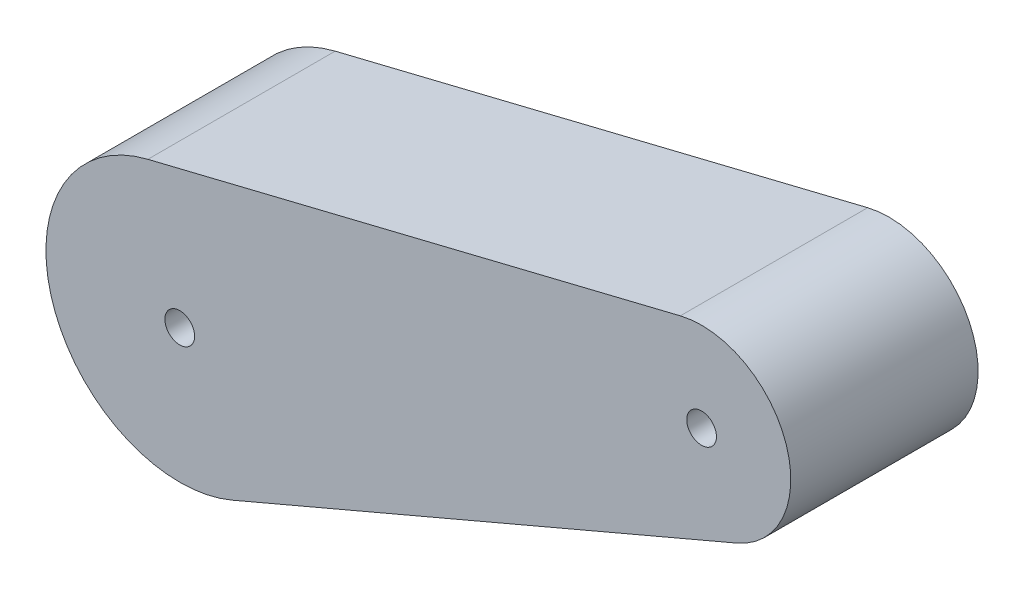
ISO-10303-21;
HEADER;
FILE_DESCRIPTION(('STEP AP214'),'2;1');
FILE_NAME('part.step','',(''),(''),'','','');
FILE_SCHEMA(('AUTOMOTIVE_DESIGN { 1 0 10303 214 1 1 1 1 }'));
ENDSEC;
DATA;
#1=APPLICATION_CONTEXT('core data for automotive mechanical design processes');
#2=APPLICATION_PROTOCOL_DEFINITION('international standard','automotive_design',2000,#1);
#3=PRODUCT_CONTEXT('',#1,'mechanical');
#4=PRODUCT('Part','Part','',(#3));
#5=PRODUCT_RELATED_PRODUCT_CATEGORY('part','',(#4));
#6=PRODUCT_DEFINITION_FORMATION('','',#4);
#7=PRODUCT_DEFINITION_CONTEXT('part definition',#1,'design');
#8=PRODUCT_DEFINITION('design','',#6,#7);
#9=PRODUCT_DEFINITION_SHAPE('','',#8);
#10=(LENGTH_UNIT() NAMED_UNIT(*) SI_UNIT(.MILLI.,.METRE.));
#11=(NAMED_UNIT(*) PLANE_ANGLE_UNIT() SI_UNIT($,.RADIAN.));
#12=(NAMED_UNIT(*) SI_UNIT($,.STERADIAN.) SOLID_ANGLE_UNIT());
#13=UNCERTAINTY_MEASURE_WITH_UNIT(LENGTH_MEASURE(1.E-05),#10,'distance_accuracy_value','');
#14=(GEOMETRIC_REPRESENTATION_CONTEXT(3) GLOBAL_UNCERTAINTY_ASSIGNED_CONTEXT((#13)) GLOBAL_UNIT_ASSIGNED_CONTEXT((#10,
#11,#12)) REPRESENTATION_CONTEXT('',''));
#15=CARTESIAN_POINT('',(0.,0.,0.));
#16=DIRECTION('',(0.,0.,1.));
#17=DIRECTION('',(1.,0.,0.));
#18=AXIS2_PLACEMENT_3D('',#15,#16,#17);
#19=CARTESIAN_POINT('',(0.,0.,31.5));
#20=DIRECTION('',(0.,0.,1.));
#21=DIRECTION('',(1.,0.,0.));
#22=AXIS2_PLACEMENT_3D('',#19,#20,#21);
#23=PLANE('',#22);
#24=CARTESIAN_POINT('',(175.503634341575,58.5104634479909,31.5));
#25=DIRECTION('',(0.,0.,1.));
#26=DIRECTION('',(1.,0.,0.));
#27=AXIS2_PLACEMENT_3D('',#24,#25,#26);
#28=CIRCLE('',#27,5.00000000000002);
#29=CARTESIAN_POINT('',(180.503634341575,58.5104634479909,31.5));
#30=VERTEX_POINT('',#29);
#31=EDGE_CURVE('E104',#30,#30,#28,.T.);
#32=ORIENTED_EDGE('',*,*,#31,.F.);
#33=EDGE_LOOP('',(#32));
#34=FACE_BOUND('',#33,.T.);
#35=CARTESIAN_POINT('',(0.,0.,31.5));
#36=DIRECTION('',(0.,0.,1.));
#37=DIRECTION('',(1.,0.,0.));
#38=AXIS2_PLACEMENT_3D('',#35,#36,#37);
#39=CIRCLE('',#38,45.);
#40=CARTESIAN_POINT('',(-10.7240579663241,43.7034847664911,31.5));
#41=VERTEX_POINT('',#40);
#42=CARTESIAN_POINT('',(17.6467725422518,-41.3955482973958,31.5));
#43=VERTEX_POINT('',#42);
#44=EDGE_CURVE('E89',#41,#43,#39,.T.);
#45=ORIENTED_EDGE('',*,*,#44,.T.);
#46=DIRECTION('',(0.919901073275462,0.39215050093893,0.));
#47=VECTOR('',#46,1.);
#48=CARTESIAN_POINT('',(17.6467725422518,-41.3955482973958,31.5));
#49=LINE('',#48,#47);
#50=CARTESIAN_POINT('',(187.268149369743,30.913431249727,31.5));
#51=VERTEX_POINT('',#50);
#52=EDGE_CURVE('E84',#43,#51,#49,.T.);
#53=ORIENTED_EDGE('',*,*,#52,.T.);
#54=CARTESIAN_POINT('',(175.503634341575,58.5104634479909,31.5));
#55=DIRECTION('',(0.,0.,1.));
#56=DIRECTION('',(1.,0.,0.));
#57=AXIS2_PLACEMENT_3D('',#54,#55,#56);
#58=CIRCLE('',#57,30.);
#59=CARTESIAN_POINT('',(168.354262364026,87.6461199589849,31.5));
#60=VERTEX_POINT('',#59);
#61=EDGE_CURVE('E87',#51,#60,#58,.T.);
#62=ORIENTED_EDGE('',*,*,#61,.T.);
#63=DIRECTION('',(-0.971188550366469,-0.238312399251647,0.));
#64=VECTOR('',#63,1.);
#65=CARTESIAN_POINT('',(-10.7240579663241,43.7034847664911,31.5));
#66=LINE('',#65,#64);
#67=EDGE_CURVE('E54',#60,#41,#66,.T.);
#68=ORIENTED_EDGE('',*,*,#67,.T.);
#69=EDGE_LOOP('',(#45,#53,#62,#68));
#70=FACE_BOUND('',#69,.T.);
#71=CARTESIAN_POINT('',(0.,0.,31.5));
#72=DIRECTION('',(0.,0.,1.));
#73=DIRECTION('',(1.,0.,0.));
#74=AXIS2_PLACEMENT_3D('',#71,#72,#73);
#75=CIRCLE('',#74,5.);
#76=CARTESIAN_POINT('',(5.,0.,31.5));
#77=VERTEX_POINT('',#76);
#78=EDGE_CURVE('E119',#77,#77,#75,.T.);
#79=ORIENTED_EDGE('',*,*,#78,.F.);
#80=EDGE_LOOP('',(#79));
#81=FACE_BOUND('',#80,.T.);
#82=ADVANCED_FACE('F37',(#34,#70,#81),#23,.T.);
#83=CARTESIAN_POINT('',(0.,0.,-31.5));
#84=DIRECTION('',(0.,0.,1.));
#85=DIRECTION('',(1.,0.,0.));
#86=AXIS2_PLACEMENT_3D('',#83,#84,#85);
#87=PLANE('',#86);
#88=CARTESIAN_POINT('',(0.,0.,-31.5));
#89=DIRECTION('',(0.,0.,1.));
#90=DIRECTION('',(1.,0.,0.));
#91=AXIS2_PLACEMENT_3D('',#88,#89,#90);
#92=CIRCLE('',#91,45.);
#93=CARTESIAN_POINT('',(-10.7240579663241,43.7034847664911,-31.5));
#94=VERTEX_POINT('',#93);
#95=CARTESIAN_POINT('',(17.6467725422518,-41.3955482973958,-31.5));
#96=VERTEX_POINT('',#95);
#97=EDGE_CURVE('E101',#94,#96,#92,.T.);
#98=ORIENTED_EDGE('',*,*,#97,.F.);
#99=DIRECTION('',(-0.971188550366469,-0.238312399251647,0.));
#100=VECTOR('',#99,1.);
#101=CARTESIAN_POINT('',(-10.7240579663241,43.7034847664911,-31.5));
#102=LINE('',#101,#100);
#103=CARTESIAN_POINT('',(168.354262364026,87.6461199589849,-31.5));
#104=VERTEX_POINT('',#103);
#105=EDGE_CURVE('E77',#104,#94,#102,.T.);
#106=ORIENTED_EDGE('',*,*,#105,.F.);
#107=CARTESIAN_POINT('',(175.503634341575,58.5104634479909,-31.5));
#108=DIRECTION('',(0.,0.,1.));
#109=DIRECTION('',(1.,0.,0.));
#110=AXIS2_PLACEMENT_3D('',#107,#108,#109);
#111=CIRCLE('',#110,30.);
#112=CARTESIAN_POINT('',(187.268149369743,30.913431249727,-31.5));
#113=VERTEX_POINT('',#112);
#114=EDGE_CURVE('E71',#113,#104,#111,.T.);
#115=ORIENTED_EDGE('',*,*,#114,.F.);
#116=DIRECTION('',(0.919901073275462,0.39215050093893,0.));
#117=VECTOR('',#116,1.);
#118=CARTESIAN_POINT('',(17.6467725422518,-41.3955482973958,-31.5));
#119=LINE('',#118,#117);
#120=EDGE_CURVE('E93',#96,#113,#119,.T.);
#121=ORIENTED_EDGE('',*,*,#120,.F.);
#122=EDGE_LOOP('',(#98,#106,#115,#121));
#123=FACE_BOUND('',#122,.T.);
#124=CARTESIAN_POINT('',(175.503634341575,58.5104634479909,-31.5));
#125=DIRECTION('',(0.,0.,1.));
#126=DIRECTION('',(1.,0.,0.));
#127=AXIS2_PLACEMENT_3D('',#124,#125,#126);
#128=CIRCLE('',#127,5.00000000000002);
#129=CARTESIAN_POINT('',(180.503634341575,58.5104634479909,-31.5));
#130=VERTEX_POINT('',#129);
#131=EDGE_CURVE('E116',#130,#130,#128,.T.);
#132=ORIENTED_EDGE('',*,*,#131,.T.);
#133=EDGE_LOOP('',(#132));
#134=FACE_BOUND('',#133,.T.);
#135=CARTESIAN_POINT('',(0.,0.,-31.5));
#136=DIRECTION('',(0.,0.,1.));
#137=DIRECTION('',(1.,0.,0.));
#138=AXIS2_PLACEMENT_3D('',#135,#136,#137);
#139=CIRCLE('',#138,5.);
#140=CARTESIAN_POINT('',(5.,0.,-31.5));
#141=VERTEX_POINT('',#140);
#142=EDGE_CURVE('E122',#141,#141,#139,.T.);
#143=ORIENTED_EDGE('',*,*,#142,.T.);
#144=EDGE_LOOP('',(#143));
#145=FACE_BOUND('',#144,.T.);
#146=ADVANCED_FACE('F112',(#123,#134,#145),#87,.F.);
#147=CARTESIAN_POINT('',(0.,0.,31.5));
#148=DIRECTION('',(0.,0.,-1.));
#149=DIRECTION('',(-1.,0.,0.));
#150=AXIS2_PLACEMENT_3D('',#147,#148,#149);
#151=CYLINDRICAL_SURFACE('',#150,45.);
#152=ORIENTED_EDGE('',*,*,#97,.T.);
#153=DIRECTION('',(0.,0.,-1.));
#154=VECTOR('',#153,1.);
#155=CARTESIAN_POINT('',(17.6467725422518,-41.3955482973958,31.5));
#156=LINE('',#155,#154);
#157=EDGE_CURVE('E11',#43,#96,#156,.T.);
#158=ORIENTED_EDGE('',*,*,#157,.F.);
#159=ORIENTED_EDGE('',*,*,#44,.F.);
#160=DIRECTION('',(0.,0.,-1.));
#161=VECTOR('',#160,1.);
#162=CARTESIAN_POINT('',(-10.7240579663241,43.7034847664911,31.5));
#163=LINE('',#162,#161);
#164=EDGE_CURVE('E97',#41,#94,#163,.T.);
#165=ORIENTED_EDGE('',*,*,#164,.T.);
#166=EDGE_LOOP('',(#152,#158,#159,#165));
#167=FACE_BOUND('',#166,.T.);
#168=ADVANCED_FACE('F39',(#167),#151,.T.);
#169=CARTESIAN_POINT('',(17.6467725422518,-41.3955482973958,31.5));
#170=DIRECTION('',(-0.39215050093893,0.919901073275462,0.));
#171=DIRECTION('',(-0.919901073275462,-0.39215050093893,0.));
#172=AXIS2_PLACEMENT_3D('',#169,#170,#171);
#173=PLANE('',#172);
#174=ORIENTED_EDGE('',*,*,#120,.T.);
#175=DIRECTION('',(0.,0.,-1.));
#176=VECTOR('',#175,1.);
#177=CARTESIAN_POINT('',(187.268149369743,30.913431249727,31.5));
#178=LINE('',#177,#176);
#179=EDGE_CURVE('E46',#51,#113,#178,.T.);
#180=ORIENTED_EDGE('',*,*,#179,.F.);
#181=ORIENTED_EDGE('',*,*,#52,.F.);
#182=ORIENTED_EDGE('',*,*,#157,.T.);
#183=EDGE_LOOP('',(#174,#180,#181,#182));
#184=FACE_BOUND('',#183,.T.);
#185=ADVANCED_FACE('F92',(#184),#173,.F.);
#186=CARTESIAN_POINT('',(175.503634341575,58.5104634479909,31.5));
#187=DIRECTION('',(0.,0.,-1.));
#188=DIRECTION('',(-1.,0.,0.));
#189=AXIS2_PLACEMENT_3D('',#186,#187,#188);
#190=CYLINDRICAL_SURFACE('',#189,30.);
#191=ORIENTED_EDGE('',*,*,#114,.T.);
#192=DIRECTION('',(0.,0.,-1.));
#193=VECTOR('',#192,1.);
#194=CARTESIAN_POINT('',(168.354262364026,87.6461199589849,31.5));
#195=LINE('',#194,#193);
#196=EDGE_CURVE('E94',#60,#104,#195,.T.);
#197=ORIENTED_EDGE('',*,*,#196,.F.);
#198=ORIENTED_EDGE('',*,*,#61,.F.);
#199=ORIENTED_EDGE('',*,*,#179,.T.);
#200=EDGE_LOOP('',(#191,#197,#198,#199));
#201=FACE_BOUND('',#200,.T.);
#202=ADVANCED_FACE('F95',(#201),#190,.T.);
#203=CARTESIAN_POINT('',(-10.7240579663241,43.7034847664911,31.5));
#204=DIRECTION('',(0.238312399251647,-0.971188550366469,0.));
#205=DIRECTION('',(0.971188550366469,0.238312399251647,0.));
#206=AXIS2_PLACEMENT_3D('',#203,#204,#205);
#207=PLANE('',#206);
#208=ORIENTED_EDGE('',*,*,#105,.T.);
#209=ORIENTED_EDGE('',*,*,#164,.F.);
#210=ORIENTED_EDGE('',*,*,#67,.F.);
#211=ORIENTED_EDGE('',*,*,#196,.T.);
#212=EDGE_LOOP('',(#208,#209,#210,#211));
#213=FACE_BOUND('',#212,.T.);
#214=ADVANCED_FACE('F109',(#213),#207,.F.);
#215=CARTESIAN_POINT('',(175.503634341575,58.5104634479909,31.5));
#216=DIRECTION('',(0.,0.,-1.));
#217=DIRECTION('',(-1.,0.,0.));
#218=AXIS2_PLACEMENT_3D('',#215,#216,#217);
#219=CYLINDRICAL_SURFACE('',#218,5.00000000000002);
#220=ORIENTED_EDGE('',*,*,#31,.T.);
#221=EDGE_LOOP('',(#220));
#222=FACE_BOUND('',#221,.T.);
#223=ORIENTED_EDGE('',*,*,#131,.F.);
#224=EDGE_LOOP('',(#223));
#225=FACE_BOUND('',#224,.T.);
#226=ADVANCED_FACE('F139',(#222,#225),#219,.F.);
#227=CARTESIAN_POINT('',(0.,0.,31.5));
#228=DIRECTION('',(0.,0.,-1.));
#229=DIRECTION('',(-1.,0.,0.));
#230=AXIS2_PLACEMENT_3D('',#227,#228,#229);
#231=CYLINDRICAL_SURFACE('',#230,5.);
#232=ORIENTED_EDGE('',*,*,#78,.T.);
#233=EDGE_LOOP('',(#232));
#234=FACE_BOUND('',#233,.T.);
#235=ORIENTED_EDGE('',*,*,#142,.F.);
#236=EDGE_LOOP('',(#235));
#237=FACE_BOUND('',#236,.T.);
#238=ADVANCED_FACE('F128',(#234,#237),#231,.F.);
#239=CLOSED_SHELL('',(#82,#146,#168,#185,#202,#214,#226,#238));
#240=MANIFOLD_SOLID_BREP('B2',#239);
#241=ADVANCED_BREP_SHAPE_REPRESENTATION('',(#18,#240),#14);
#242=SHAPE_DEFINITION_REPRESENTATION(#9,#241);
ENDSEC;
END-ISO-10303-21;
